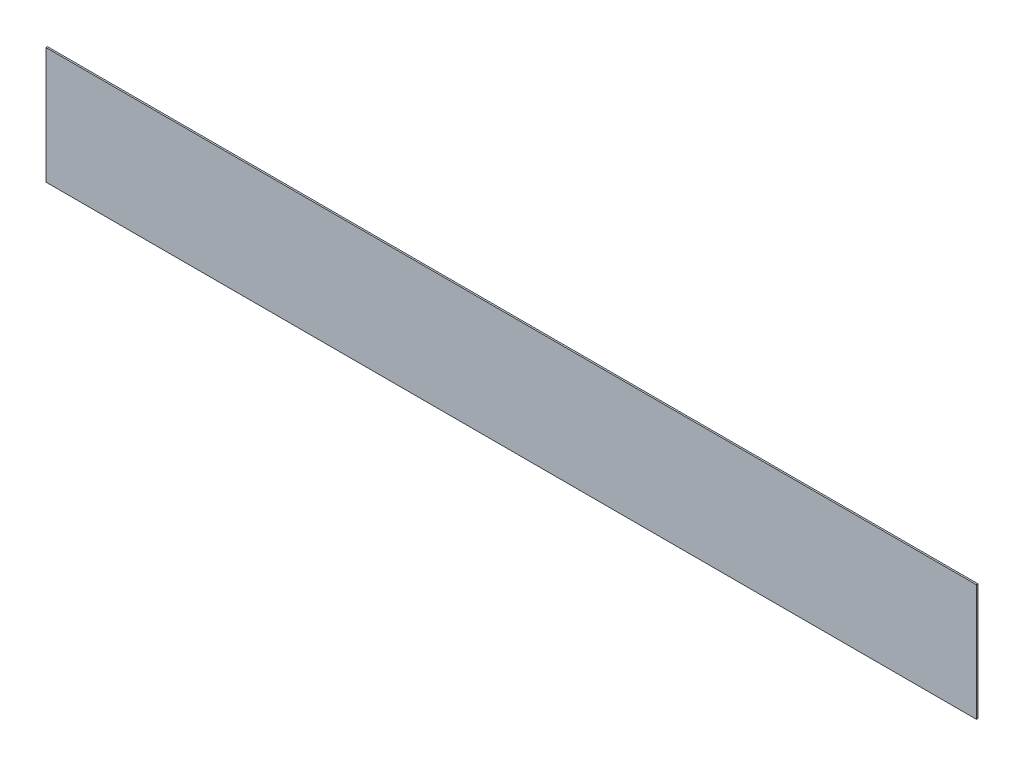
ISO-10303-21;
HEADER;
FILE_DESCRIPTION(('STEP AP214'),'2;1');
FILE_NAME('part.step','',(''),(''),'','','');
FILE_SCHEMA(('AUTOMOTIVE_DESIGN { 1 0 10303 214 1 1 1 1 }'));
ENDSEC;
DATA;
#1=APPLICATION_CONTEXT('core data for automotive mechanical design processes');
#2=APPLICATION_PROTOCOL_DEFINITION('international standard','automotive_design',2000,#1);
#3=PRODUCT_CONTEXT('',#1,'mechanical');
#4=PRODUCT('Part','Part','',(#3));
#5=PRODUCT_RELATED_PRODUCT_CATEGORY('part','',(#4));
#6=PRODUCT_DEFINITION_FORMATION('','',#4);
#7=PRODUCT_DEFINITION_CONTEXT('part definition',#1,'design');
#8=PRODUCT_DEFINITION('design','',#6,#7);
#9=PRODUCT_DEFINITION_SHAPE('','',#8);
#10=(LENGTH_UNIT() NAMED_UNIT(*) SI_UNIT(.MILLI.,.METRE.));
#11=(NAMED_UNIT(*) PLANE_ANGLE_UNIT() SI_UNIT($,.RADIAN.));
#12=(NAMED_UNIT(*) SI_UNIT($,.STERADIAN.) SOLID_ANGLE_UNIT());
#13=UNCERTAINTY_MEASURE_WITH_UNIT(LENGTH_MEASURE(1.E-05),#10,'distance_accuracy_value','');
#14=(GEOMETRIC_REPRESENTATION_CONTEXT(3) GLOBAL_UNCERTAINTY_ASSIGNED_CONTEXT((#13)) GLOBAL_UNIT_ASSIGNED_CONTEXT((#10,
#11,#12)) REPRESENTATION_CONTEXT('',''));
#15=CARTESIAN_POINT('',(0.,0.,0.));
#16=DIRECTION('',(0.,0.,1.));
#17=DIRECTION('',(1.,0.,0.));
#18=AXIS2_PLACEMENT_3D('',#15,#16,#17);
#19=CARTESIAN_POINT('',(13.7,8.,-700.));
#20=DIRECTION('',(-1.,0.,0.));
#21=DIRECTION('',(0.,0.,1.));
#22=AXIS2_PLACEMENT_3D('',#19,#20,#21);
#23=PLANE('',#22);
#24=DIRECTION('',(0.,-1.,0.));
#25=VECTOR('',#24,1.);
#26=CARTESIAN_POINT('',(13.7,8.,-699.));
#27=LINE('',#26,#25);
#28=CARTESIAN_POINT('',(13.7,82.,-699.));
#29=VERTEX_POINT('',#28);
#30=CARTESIAN_POINT('',(13.7,8.,-699.));
#31=VERTEX_POINT('',#30);
#32=EDGE_CURVE('E103',#29,#31,#27,.T.);
#33=ORIENTED_EDGE('',*,*,#32,.F.);
#34=DIRECTION('',(0.,0.,1.));
#35=VECTOR('',#34,1.);
#36=CARTESIAN_POINT('',(13.7,82.,-700.));
#37=LINE('',#36,#35);
#38=CARTESIAN_POINT('',(13.7,82.,-700.));
#39=VERTEX_POINT('',#38);
#40=EDGE_CURVE('E11',#39,#29,#37,.T.);
#41=ORIENTED_EDGE('',*,*,#40,.F.);
#42=DIRECTION('',(0.,-1.,0.));
#43=VECTOR('',#42,1.);
#44=CARTESIAN_POINT('',(13.7,8.,-700.));
#45=LINE('',#44,#43);
#46=CARTESIAN_POINT('',(13.7,8.,-700.));
#47=VERTEX_POINT('',#46);
#48=EDGE_CURVE('E97',#39,#47,#45,.T.);
#49=ORIENTED_EDGE('',*,*,#48,.T.);
#50=DIRECTION('',(0.,0.,1.));
#51=VECTOR('',#50,1.);
#52=CARTESIAN_POINT('',(13.7,8.,-700.));
#53=LINE('',#52,#51);
#54=EDGE_CURVE('E42',#47,#31,#53,.T.);
#55=ORIENTED_EDGE('',*,*,#54,.T.);
#56=EDGE_LOOP('',(#33,#41,#49,#55));
#57=FACE_BOUND('',#56,.T.);
#58=ADVANCED_FACE('F39',(#57),#23,.T.);
#59=CARTESIAN_POINT('',(13.7,82.,-700.));
#60=DIRECTION('',(0.,1.,0.));
#61=DIRECTION('',(0.,0.,1.));
#62=AXIS2_PLACEMENT_3D('',#59,#60,#61);
#63=PLANE('',#62);
#64=DIRECTION('',(-1.,0.,0.));
#65=VECTOR('',#64,1.);
#66=CARTESIAN_POINT('',(13.7,82.,-699.));
#67=LINE('',#66,#65);
#68=CARTESIAN_POINT('',(604.3,82.,-699.));
#69=VERTEX_POINT('',#68);
#70=EDGE_CURVE('E99',#69,#29,#67,.T.);
#71=ORIENTED_EDGE('',*,*,#70,.F.);
#72=DIRECTION('',(0.,0.,1.));
#73=VECTOR('',#72,1.);
#74=CARTESIAN_POINT('',(604.3,82.,-700.));
#75=LINE('',#74,#73);
#76=CARTESIAN_POINT('',(604.3,82.,-700.));
#77=VERTEX_POINT('',#76);
#78=EDGE_CURVE('E48',#77,#69,#75,.T.);
#79=ORIENTED_EDGE('',*,*,#78,.F.);
#80=DIRECTION('',(-1.,0.,0.));
#81=VECTOR('',#80,1.);
#82=CARTESIAN_POINT('',(13.7,82.,-700.));
#83=LINE('',#82,#81);
#84=EDGE_CURVE('E94',#77,#39,#83,.T.);
#85=ORIENTED_EDGE('',*,*,#84,.T.);
#86=ORIENTED_EDGE('',*,*,#40,.T.);
#87=EDGE_LOOP('',(#71,#79,#85,#86));
#88=FACE_BOUND('',#87,.T.);
#89=ADVANCED_FACE('F113',(#88),#63,.T.);
#90=CARTESIAN_POINT('',(604.3,8.,-700.));
#91=DIRECTION('',(1.,0.,0.));
#92=DIRECTION('',(0.,0.,-1.));
#93=AXIS2_PLACEMENT_3D('',#90,#91,#92);
#94=PLANE('',#93);
#95=DIRECTION('',(0.,1.,0.));
#96=VECTOR('',#95,1.);
#97=CARTESIAN_POINT('',(604.3,8.,-699.));
#98=LINE('',#97,#96);
#99=CARTESIAN_POINT('',(604.3,8.,-699.));
#100=VERTEX_POINT('',#99);
#101=EDGE_CURVE('E89',#100,#69,#98,.T.);
#102=ORIENTED_EDGE('',*,*,#101,.F.);
#103=DIRECTION('',(0.,0.,1.));
#104=VECTOR('',#103,1.);
#105=CARTESIAN_POINT('',(604.3,8.,-700.));
#106=LINE('',#105,#104);
#107=CARTESIAN_POINT('',(604.3,8.,-700.));
#108=VERTEX_POINT('',#107);
#109=EDGE_CURVE('E84',#108,#100,#106,.T.);
#110=ORIENTED_EDGE('',*,*,#109,.F.);
#111=DIRECTION('',(0.,1.,0.));
#112=VECTOR('',#111,1.);
#113=CARTESIAN_POINT('',(604.3,8.,-700.));
#114=LINE('',#113,#112);
#115=EDGE_CURVE('E87',#108,#77,#114,.T.);
#116=ORIENTED_EDGE('',*,*,#115,.T.);
#117=ORIENTED_EDGE('',*,*,#78,.T.);
#118=EDGE_LOOP('',(#102,#110,#116,#117));
#119=FACE_BOUND('',#118,.T.);
#120=ADVANCED_FACE('F86',(#119),#94,.T.);
#121=CARTESIAN_POINT('',(13.7,8.,-700.));
#122=DIRECTION('',(0.,-1.,0.));
#123=DIRECTION('',(0.,0.,-1.));
#124=AXIS2_PLACEMENT_3D('',#121,#122,#123);
#125=PLANE('',#124);
#126=DIRECTION('',(1.,0.,0.));
#127=VECTOR('',#126,1.);
#128=CARTESIAN_POINT('',(13.7,8.,-699.));
#129=LINE('',#128,#127);
#130=EDGE_CURVE('E106',#31,#100,#129,.T.);
#131=ORIENTED_EDGE('',*,*,#130,.F.);
#132=ORIENTED_EDGE('',*,*,#54,.F.);
#133=DIRECTION('',(1.,0.,0.));
#134=VECTOR('',#133,1.);
#135=CARTESIAN_POINT('',(13.7,8.,-700.));
#136=LINE('',#135,#134);
#137=EDGE_CURVE('E93',#47,#108,#136,.T.);
#138=ORIENTED_EDGE('',*,*,#137,.T.);
#139=ORIENTED_EDGE('',*,*,#109,.T.);
#140=EDGE_LOOP('',(#131,#132,#138,#139));
#141=FACE_BOUND('',#140,.T.);
#142=ADVANCED_FACE('F96',(#141),#125,.T.);
#143=CARTESIAN_POINT('',(0.,0.,-700.));
#144=DIRECTION('',(0.,0.,-1.));
#145=DIRECTION('',(-1.,0.,0.));
#146=AXIS2_PLACEMENT_3D('',#143,#144,#145);
#147=PLANE('',#146);
#148=ORIENTED_EDGE('',*,*,#48,.F.);
#149=ORIENTED_EDGE('',*,*,#84,.F.);
#150=ORIENTED_EDGE('',*,*,#115,.F.);
#151=ORIENTED_EDGE('',*,*,#137,.F.);
#152=EDGE_LOOP('',(#148,#149,#150,#151));
#153=FACE_BOUND('',#152,.T.);
#154=ADVANCED_FACE('F92',(#153),#147,.T.);
#155=CARTESIAN_POINT('',(0.,0.,-699.));
#156=DIRECTION('',(0.,0.,-1.));
#157=DIRECTION('',(-1.,0.,0.));
#158=AXIS2_PLACEMENT_3D('',#155,#156,#157);
#159=PLANE('',#158);
#160=ORIENTED_EDGE('',*,*,#32,.T.);
#161=ORIENTED_EDGE('',*,*,#130,.T.);
#162=ORIENTED_EDGE('',*,*,#101,.T.);
#163=ORIENTED_EDGE('',*,*,#70,.T.);
#164=EDGE_LOOP('',(#160,#161,#162,#163));
#165=FACE_BOUND('',#164,.T.);
#166=ADVANCED_FACE('F112',(#165),#159,.F.);
#167=CLOSED_SHELL('',(#58,#89,#120,#142,#154,#166));
#168=MANIFOLD_SOLID_BREP('B2',#167);
#169=ADVANCED_BREP_SHAPE_REPRESENTATION('',(#18,#168),#14);
#170=SHAPE_DEFINITION_REPRESENTATION(#9,#169);
ENDSEC;
END-ISO-10303-21;
